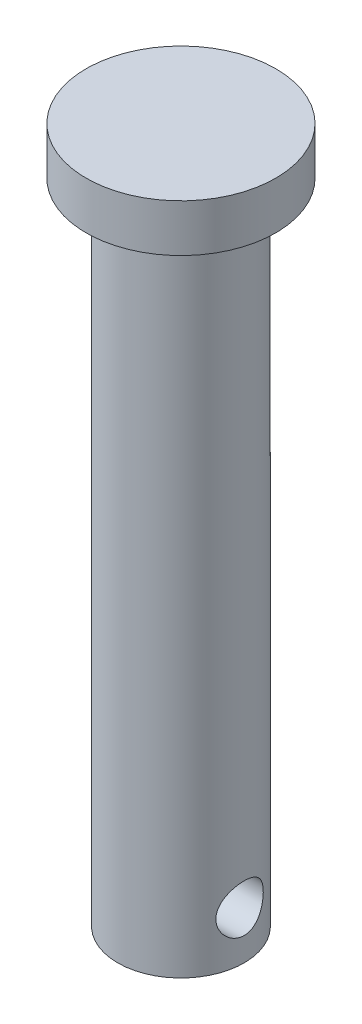
ISO-10303-21;
HEADER;
FILE_DESCRIPTION(('STEP AP214'),'2;1');
FILE_NAME('part.step','',(''),(''),'','','');
FILE_SCHEMA(('AUTOMOTIVE_DESIGN { 1 0 10303 214 1 1 1 1 }'));
ENDSEC;
DATA;
#1=APPLICATION_CONTEXT('core data for automotive mechanical design processes');
#2=APPLICATION_PROTOCOL_DEFINITION('international standard','automotive_design',2000,#1);
#3=PRODUCT_CONTEXT('',#1,'mechanical');
#4=PRODUCT('Part','Part','',(#3));
#5=PRODUCT_RELATED_PRODUCT_CATEGORY('part','',(#4));
#6=PRODUCT_DEFINITION_FORMATION('','',#4);
#7=PRODUCT_DEFINITION_CONTEXT('part definition',#1,'design');
#8=PRODUCT_DEFINITION('design','',#6,#7);
#9=PRODUCT_DEFINITION_SHAPE('','',#8);
#10=(LENGTH_UNIT() NAMED_UNIT(*) SI_UNIT(.MILLI.,.METRE.));
#11=(NAMED_UNIT(*) PLANE_ANGLE_UNIT() SI_UNIT($,.RADIAN.));
#12=(NAMED_UNIT(*) SI_UNIT($,.STERADIAN.) SOLID_ANGLE_UNIT());
#13=UNCERTAINTY_MEASURE_WITH_UNIT(LENGTH_MEASURE(1.E-05),#10,'distance_accuracy_value','');
#14=(GEOMETRIC_REPRESENTATION_CONTEXT(3) GLOBAL_UNCERTAINTY_ASSIGNED_CONTEXT((#13)) GLOBAL_UNIT_ASSIGNED_CONTEXT((#10,
#11,#12)) REPRESENTATION_CONTEXT('',''));
#15=CARTESIAN_POINT('',(0.,0.,0.));
#16=DIRECTION('',(0.,0.,1.));
#17=DIRECTION('',(1.,0.,0.));
#18=AXIS2_PLACEMENT_3D('',#15,#16,#17);
#19=CARTESIAN_POINT('',(0.,-34.,0.));
#20=DIRECTION('',(0.,1.,0.));
#21=DIRECTION('',(0.,0.,1.));
#22=AXIS2_PLACEMENT_3D('',#19,#20,#21);
#23=CYLINDRICAL_SURFACE('',#22,4.);
#24=CARTESIAN_POINT('',(3.7084298808649,-38.0495195041543,-1.49918238340381));
#25=CARTESIAN_POINT('',(3.70735153882818,-37.9689942578747,-1.50184556572112));
#26=CARTESIAN_POINT('',(3.70892688062295,-37.8882395568046,-1.49799349758537));
#27=CARTESIAN_POINT('',(3.71715993590129,-37.7286607449023,-1.47744506200237));
#28=CARTESIAN_POINT('',(3.72381701904395,-37.6498363958799,-1.46075028756678));
#29=CARTESIAN_POINT('',(3.74135277213261,-37.496489204384,-1.41522607325458));
#30=CARTESIAN_POINT('',(3.75222219397304,-37.4219573467462,-1.38642320479918));
#31=CARTESIAN_POINT('',(3.77692652400711,-37.2787811631056,-1.31763293053049));
#32=CARTESIAN_POINT('',(3.79076238816472,-37.2101387450383,-1.27764191796287));
#33=CARTESIAN_POINT('',(3.82057211864874,-37.0774299901233,-1.18560607122318));
#34=CARTESIAN_POINT('',(3.83661222672121,-37.0136861335884,-1.13311786291238));
#35=CARTESIAN_POINT('',(3.86864337007483,-36.8956288555774,-1.01840164354262));
#36=CARTESIAN_POINT('',(3.88463439210092,-36.8413177930982,-0.956171203478271));
#37=CARTESIAN_POINT('',(3.91557267695215,-36.7414038795145,-0.820560967202367));
#38=CARTESIAN_POINT('',(3.93044772922005,-36.6962634924048,-0.746822264879329));
#39=CARTESIAN_POINT('',(3.95669807204479,-36.6191380486328,-0.59218151317403));
#40=CARTESIAN_POINT('',(3.96807436243848,-36.5871492327805,-0.511281518791776));
#41=CARTESIAN_POINT('',(3.98567606756755,-36.5384557864282,-0.347708373466162));
#42=CARTESIAN_POINT('',(3.99207436038323,-36.5212358187946,-0.265207770069978));
#43=CARTESIAN_POINT('',(3.99966445088374,-36.5008640444887,-0.0982626967149754));
#44=CARTESIAN_POINT('',(4.00085818049662,-36.4977070176591,-0.0138189597482992));
#45=CARTESIAN_POINT('',(3.997987557776,-36.5053722818006,0.149782513511418));
#46=CARTESIAN_POINT('',(3.99420135768012,-36.5154550198635,0.228981160339728));
#47=CARTESIAN_POINT('',(3.98224464544293,-36.5479328436569,0.384459268726347));
#48=CARTESIAN_POINT('',(3.97407396706008,-36.5703283962398,0.460738619479362));
#49=CARTESIAN_POINT('',(3.9540973850599,-36.6268335818509,0.608887172196012));
#50=CARTESIAN_POINT('',(3.94226770310655,-36.6610200111714,0.680723726596261));
#51=CARTESIAN_POINT('',(3.91613389899252,-36.7400425640397,0.817783618955661));
#52=CARTESIAN_POINT('',(3.90182904647087,-36.7848818324351,0.883004995905559));
#53=CARTESIAN_POINT('',(3.87123344358808,-36.8869198447991,1.00895502567161));
#54=CARTESIAN_POINT('',(3.85487594418544,-36.9446779963665,1.06921470011159));
#55=CARTESIAN_POINT('',(3.82260207326242,-37.0694547610585,1.1794140590491));
#56=CARTESIAN_POINT('',(3.80668583965086,-37.1364762309377,1.22935054803286));
#57=CARTESIAN_POINT('',(3.77660289612442,-37.2804028548829,1.31893011255491));
#58=CARTESIAN_POINT('',(3.76250371584498,-37.3575457522116,1.35821591021273));
#59=CARTESIAN_POINT('',(3.73845685952126,-37.5179945744436,1.42307703579286));
#60=CARTESIAN_POINT('',(3.72850713897166,-37.6012974403541,1.44865911752738));
#61=CARTESIAN_POINT('',(3.71451183014456,-37.7673953239701,1.48416702082841));
#62=CARTESIAN_POINT('',(3.71020238710239,-37.8500176267676,1.49479441922828));
#63=CARTESIAN_POINT('',(3.70720681340884,-38.0159702327687,1.50221087766291));
#64=CARTESIAN_POINT('',(3.70851881920008,-38.0993002922039,1.4990045237));
#65=CARTESIAN_POINT('',(3.71635377515466,-38.2595189868606,1.47946292004948));
#66=CARTESIAN_POINT('',(3.72258995235245,-38.3365117178014,1.46384989805853));
#67=CARTESIAN_POINT('',(3.73915956251693,-38.4867171775777,1.42098877798612));
#68=CARTESIAN_POINT('',(3.74949373288406,-38.5599292234288,1.39373858582288));
#69=CARTESIAN_POINT('',(3.77344844932528,-38.7028706375696,1.32753713716937));
#70=CARTESIAN_POINT('',(3.78715457614463,-38.7724403933945,1.28827335672108));
#71=CARTESIAN_POINT('',(3.8162228839049,-38.9042673348096,1.19942662466771));
#72=CARTESIAN_POINT('',(3.83158565742597,-38.9665218870116,1.14983997464584));
#73=CARTESIAN_POINT('',(3.86346706469129,-39.086244666256,1.0378932311589));
#74=CARTESIAN_POINT('',(3.8799950657166,-39.1431258261599,0.974906095214866));
#75=CARTESIAN_POINT('',(3.91142238729319,-39.2456365998545,0.839980697952929));
#76=CARTESIAN_POINT('',(3.92632157538038,-39.2912652989112,0.768041709636549));
#77=CARTESIAN_POINT('',(3.95295267870394,-39.3701183388866,0.616529466815145));
#78=CARTESIAN_POINT('',(3.96466520535231,-39.4032671971622,0.536913303134666));
#79=CARTESIAN_POINT('',(3.983455968431,-39.455514044107,0.372685411784113));
#80=CARTESIAN_POINT('',(3.99053636039781,-39.4746185687365,0.288076027691915));
#81=CARTESIAN_POINT('',(3.99897877989662,-39.4973088836757,0.121400148734808));
#82=CARTESIAN_POINT('',(4.00064072242595,-39.5017089471445,0.0394592625631573));
#83=CARTESIAN_POINT('',(3.99891276324032,-39.4971001447576,-0.12398163379698));
#84=CARTESIAN_POINT('',(3.99552371713104,-39.4880935499057,-0.2054817163079));
#85=CARTESIAN_POINT('',(3.98424884471712,-39.4575423126647,-0.363056536261505));
#86=CARTESIAN_POINT('',(3.97650880322926,-39.4364037075558,-0.439221349172057));
#87=CARTESIAN_POINT('',(3.95741077544833,-39.3826528508869,-0.586897611437683));
#88=CARTESIAN_POINT('',(3.94605219945738,-39.350038729118,-0.658408300039859));
#89=CARTESIAN_POINT('',(3.92033471581983,-39.2729451785436,-0.797601126838279));
#90=CARTESIAN_POINT('',(3.90588230012393,-39.228079920934,-0.865051866338088));
#91=CARTESIAN_POINT('',(3.87566143207394,-39.1282780429793,-0.991713371692146));
#92=CARTESIAN_POINT('',(3.859892534614,-39.073338008753,-1.05092133244571));
#93=CARTESIAN_POINT('',(3.82770803196436,-38.9513130738008,-1.16285551509517));
#94=CARTESIAN_POINT('',(3.81130554383115,-38.8837209887232,-1.21503447385677));
#95=CARTESIAN_POINT('',(3.78062769464247,-38.7403018833863,-1.30737503130182));
#96=CARTESIAN_POINT('',(3.76635290207588,-38.6644726716108,-1.34753342114564));
#97=CARTESIAN_POINT('',(3.74090747981774,-38.5012811801681,-1.41671127308708));
#98=CARTESIAN_POINT('',(3.73000286452594,-38.4134883516224,-1.44482406815788));
#99=CARTESIAN_POINT('',(3.71438415779382,-38.2337350920049,-1.48452770919841));
#100=CARTESIAN_POINT('',(3.70966534558171,-38.1417778945373,-1.49613115505937));
#101=CARTESIAN_POINT('',(3.7084298808649,-38.0495195041543,-1.49918238340381));
#102=B_SPLINE_CURVE_WITH_KNOTS('',3,(#24,#25,#26,#27,#28,#29,#30,#31,#32,#33,#34,#35,#36,#37,
#38,#39,#40,#41,#42,#43,#44,#45,#46,#47,#48,#49,#50,#51,#52,#53,#54,#55,#56,#57,#58,#59,#60,#61,
#62,#63,#64,#65,#66,#67,#68,#69,#70,#71,#72,#73,#74,#75,#76,#77,#78,#79,#80,#81,#82,#83,#84,#85,
#86,#87,#88,#89,#90,#91,#92,#93,#94,#95,#96,#97,#98,#99,#100,#101),.UNSPECIFIED.,.T.,.F.,(4,2,2,
2,2,2,2,2,2,2,2,2,2,2,2,2,2,2,2,2,2,2,2,2,2,2,2,2,2,2,2,2,2,2,2,2,2,2,4),(0.,0.241390809926823,
0.48275168251987,0.723585627003748,0.964497299461813,1.21574031253197,1.46704606743034,
1.72892397556958,1.99072697749685,2.24297252270468,2.49512442667175,2.73377334593765,
2.97243131443655,3.2126740180258,3.45298773250122,3.70701924206622,3.96112926903046,
4.22293007689732,4.48460173847381,4.73353416952038,4.98238408376712,5.21772376025691,
5.45310580343223,5.69522355806603,5.93742820696935,6.1956181550003,6.45382908487313,
6.71357759311371,6.9732051427835,7.21819383138389,7.46314102515906,7.70033216519318,
7.93756197909594,8.18335564634208,8.42923275624425,8.68885290085673,8.94854228827955,
9.22531693214422,9.50188022882432),.UNSPECIFIED.);
#103=CARTESIAN_POINT('',(3.7084298808649,-38.0495195041543,-1.49918238340381));
#104=VERTEX_POINT('',#103);
#105=EDGE_CURVE('E36',#104,#104,#102,.T.);
#106=ORIENTED_EDGE('',*,*,#105,.F.);
#107=EDGE_LOOP('',(#106));
#108=FACE_BOUND('',#107,.T.);
#109=CARTESIAN_POINT('',(-3.7084298808649,-37.9504804958457,-1.49918238340381));
#110=CARTESIAN_POINT('',(-3.70735153882818,-38.0310057421253,-1.50184556572112));
#111=CARTESIAN_POINT('',(-3.70892688062294,-38.1117604431954,-1.49799349758538));
#112=CARTESIAN_POINT('',(-3.7171599359013,-38.2713392550977,-1.47744506200237));
#113=CARTESIAN_POINT('',(-3.72381701904396,-38.3501636041201,-1.46075028756677));
#114=CARTESIAN_POINT('',(-3.74135277213262,-38.503510795616,-1.41522607325457));
#115=CARTESIAN_POINT('',(-3.75222219397304,-38.5780426532538,-1.38642320479918));
#116=CARTESIAN_POINT('',(-3.77692652400711,-38.7212188368944,-1.31763293053049));
#117=CARTESIAN_POINT('',(-3.79076238816473,-38.7898612549617,-1.27764191796286));
#118=CARTESIAN_POINT('',(-3.82057211864875,-38.9225700098767,-1.18560607122317));
#119=CARTESIAN_POINT('',(-3.83661222672122,-38.9863138664116,-1.13311786291238));
#120=CARTESIAN_POINT('',(-3.86864337007483,-39.1043711444226,-1.01840164354262));
#121=CARTESIAN_POINT('',(-3.88463439210093,-39.1586822069018,-0.956171203478263));
#122=CARTESIAN_POINT('',(-3.91557267695215,-39.2585961204855,-0.820560967202357));
#123=CARTESIAN_POINT('',(-3.93044772922005,-39.3037365075952,-0.74682226487932));
#124=CARTESIAN_POINT('',(-3.95669807204479,-39.3808619513672,-0.592181513174017));
#125=CARTESIAN_POINT('',(-3.96807436243848,-39.4128507672195,-0.51128151879176));
#126=CARTESIAN_POINT('',(-3.98567606756755,-39.4615442135718,-0.347708373466142));
#127=CARTESIAN_POINT('',(-3.99207436038323,-39.4787641812054,-0.26520777006996));
#128=CARTESIAN_POINT('',(-3.99966445088374,-39.4991359555113,-0.0982626967149576));
#129=CARTESIAN_POINT('',(-4.00085818049662,-39.5022929823409,-0.0138189597482813));
#130=CARTESIAN_POINT('',(-3.997987557776,-39.4946277181994,0.149782513511435));
#131=CARTESIAN_POINT('',(-3.99420135768012,-39.4845449801365,0.228981160339746));
#132=CARTESIAN_POINT('',(-3.98224464544293,-39.4520671563431,0.384459268726364));
#133=CARTESIAN_POINT('',(-3.97407396706008,-39.4296716037602,0.460738619479378));
#134=CARTESIAN_POINT('',(-3.9540973850599,-39.3731664181491,0.608887172196025));
#135=CARTESIAN_POINT('',(-3.94226770310655,-39.3389799888286,0.680723726596271));
#136=CARTESIAN_POINT('',(-3.91613389899251,-39.2599574359603,0.817783618955672));
#137=CARTESIAN_POINT('',(-3.90182904647086,-39.2151181675649,0.883004995905573));
#138=CARTESIAN_POINT('',(-3.87123344358808,-39.1130801552009,1.00895502567162));
#139=CARTESIAN_POINT('',(-3.85487594418544,-39.0553220036335,1.06921470011159));
#140=CARTESIAN_POINT('',(-3.82260207326242,-38.9305452389415,1.1794140590491));
#141=CARTESIAN_POINT('',(-3.80668583965086,-38.8635237690623,1.22935054803287));
#142=CARTESIAN_POINT('',(-3.77660289612442,-38.7195971451171,1.31893011255492));
#143=CARTESIAN_POINT('',(-3.76250371584498,-38.6424542477884,1.35821591021273));
#144=CARTESIAN_POINT('',(-3.73845685952126,-38.4820054255564,1.42307703579286));
#145=CARTESIAN_POINT('',(-3.72850713897166,-38.3987025596459,1.44865911752738));
#146=CARTESIAN_POINT('',(-3.71451183014456,-38.2326046760299,1.48416702082842));
#147=CARTESIAN_POINT('',(-3.71020238710239,-38.1499823732324,1.49479441922828));
#148=CARTESIAN_POINT('',(-3.70720681340884,-37.9840297672313,1.5022108776629));
#149=CARTESIAN_POINT('',(-3.70851881920008,-37.9006997077961,1.49900452369999));
#150=CARTESIAN_POINT('',(-3.71635377515466,-37.7404810131394,1.47946292004948));
#151=CARTESIAN_POINT('',(-3.72258995235245,-37.6634882821986,1.46384989805853));
#152=CARTESIAN_POINT('',(-3.73915956251693,-37.5132828224223,1.42098877798612));
#153=CARTESIAN_POINT('',(-3.74949373288407,-37.4400707765713,1.39373858582287));
#154=CARTESIAN_POINT('',(-3.77344844932528,-37.2971293624304,1.32753713716936));
#155=CARTESIAN_POINT('',(-3.78715457614463,-37.2275596066055,1.28827335672108));
#156=CARTESIAN_POINT('',(-3.81622288390489,-37.0957326651904,1.19942662466772));
#157=CARTESIAN_POINT('',(-3.83158565742597,-37.0334781129884,1.14983997464584));
#158=CARTESIAN_POINT('',(-3.8634670646913,-36.913755333744,1.03789323115889));
#159=CARTESIAN_POINT('',(-3.8799950657166,-36.8568741738401,0.974906095214866));
#160=CARTESIAN_POINT('',(-3.91142238729319,-36.7543634001455,0.839980697952928));
#161=CARTESIAN_POINT('',(-3.92632157538038,-36.7087347010888,0.76804170963654));
#162=CARTESIAN_POINT('',(-3.95295267870394,-36.6298816611134,0.616529466815131));
#163=CARTESIAN_POINT('',(-3.96466520535231,-36.5967328028378,0.536913303134656));
#164=CARTESIAN_POINT('',(-3.98345596843101,-36.544485955893,0.372685411784102));
#165=CARTESIAN_POINT('',(-3.99053636039782,-36.5253814312635,0.2880760276919));
#166=CARTESIAN_POINT('',(-3.99897877989662,-36.5026911163243,0.121400148734788));
#167=CARTESIAN_POINT('',(-4.00064072242595,-36.4982910528555,0.0394592625631396));
#168=CARTESIAN_POINT('',(-3.99891276324032,-36.5028998552424,-0.123981633796996));
#169=CARTESIAN_POINT('',(-3.99552371713104,-36.5119064500943,-0.205481716307916));
#170=CARTESIAN_POINT('',(-3.98424884471712,-36.5424576873353,-0.363056536261521));
#171=CARTESIAN_POINT('',(-3.97650880322925,-36.5635962924442,-0.439221349172073));
#172=CARTESIAN_POINT('',(-3.95741077544833,-36.6173471491131,-0.586897611437698));
#173=CARTESIAN_POINT('',(-3.94605219945738,-36.649961270882,-0.658408300039873));
#174=CARTESIAN_POINT('',(-3.92033471581982,-36.7270548214565,-0.797601126838299));
#175=CARTESIAN_POINT('',(-3.90588230012393,-36.771920079066,-0.865051866338114));
#176=CARTESIAN_POINT('',(-3.87566143207393,-36.8717219570207,-0.991713371692169));
#177=CARTESIAN_POINT('',(-3.85989253461399,-36.926661991247,-1.05092133244572));
#178=CARTESIAN_POINT('',(-3.82770803196435,-37.0486869261992,-1.16285551509517));
#179=CARTESIAN_POINT('',(-3.81130554383115,-37.1162790112769,-1.21503447385678));
#180=CARTESIAN_POINT('',(-3.78062769464246,-37.2596981166137,-1.30737503130183));
#181=CARTESIAN_POINT('',(-3.76635290207588,-37.3355273283892,-1.34753342114565));
#182=CARTESIAN_POINT('',(-3.74090747981774,-37.4987188198319,-1.41671127308709));
#183=CARTESIAN_POINT('',(-3.73000286452594,-37.5865116483776,-1.44482406815788));
#184=CARTESIAN_POINT('',(-3.71438415779382,-37.7662649079951,-1.48452770919841));
#185=CARTESIAN_POINT('',(-3.70966534558171,-37.8582221054627,-1.49613115505937));
#186=CARTESIAN_POINT('',(-3.7084298808649,-37.9504804958457,-1.49918238340381));
#187=B_SPLINE_CURVE_WITH_KNOTS('',3,(#109,#110,#111,#112,#113,#114,#115,#116,#117,#118,#119,
#120,#121,#122,#123,#124,#125,#126,#127,#128,#129,#130,#131,#132,#133,#134,#135,#136,#137,#138,
#139,#140,#141,#142,#143,#144,#145,#146,#147,#148,#149,#150,#151,#152,#153,#154,#155,#156,#157,
#158,#159,#160,#161,#162,#163,#164,#165,#166,#167,#168,#169,#170,#171,#172,#173,#174,#175,#176,
#177,#178,#179,#180,#181,#182,#183,#184,#185,#186),.UNSPECIFIED.,.T.,.F.,(4,2,2,2,2,2,2,2,2,2,2,
2,2,2,2,2,2,2,2,2,2,2,2,2,2,2,2,2,2,2,2,2,2,2,2,2,2,2,4),(0.,0.24139080992683,0.482751682519872,
0.723585627003739,0.964497299461811,1.21574031253198,1.46704606743035,1.72892397556959,
1.99072697749687,2.24297252270469,2.49512442667176,2.73377334593766,2.97243131443656,
3.21267401802581,3.45298773250123,3.70701924206622,3.96112926903046,4.22293007689731,
4.4846017384738,4.73353416952038,4.98238408376712,5.2177237602569,5.45310580343223,
5.69522355806602,5.93742820696935,6.1956181550003,6.45382908487313,6.71357759311371,
6.97320514278351,7.2181938313839,7.46314102515906,7.70033216519319,7.93756197909594,
8.1833556463421,8.42923275624428,8.68885290085674,8.94854228827954,9.22531693214421,
9.5018802288243),.UNSPECIFIED.);
#188=CARTESIAN_POINT('',(-3.7084298808649,-37.9504804958457,-1.49918238340381));
#189=VERTEX_POINT('',#188);
#190=EDGE_CURVE('E29',#189,#189,#187,.T.);
#191=ORIENTED_EDGE('',*,*,#190,.F.);
#192=EDGE_LOOP('',(#191));
#193=FACE_BOUND('',#192,.T.);
#194=CARTESIAN_POINT('',(0.,-41.,0.));
#195=DIRECTION('',(0.,1.,0.));
#196=DIRECTION('',(0.,0.,1.));
#197=AXIS2_PLACEMENT_3D('',#194,#195,#196);
#198=CIRCLE('',#197,4.);
#199=CARTESIAN_POINT('',(0.,-41.,4.));
#200=VERTEX_POINT('',#199);
#201=EDGE_CURVE('E10',#200,#200,#198,.T.);
#202=ORIENTED_EDGE('',*,*,#201,.T.);
#203=EDGE_LOOP('',(#202));
#204=FACE_BOUND('',#203,.T.);
#205=CARTESIAN_POINT('',(0.,0.,0.));
#206=DIRECTION('',(0.,-1.,0.));
#207=DIRECTION('',(0.,0.,-1.));
#208=AXIS2_PLACEMENT_3D('',#205,#206,#207);
#209=CIRCLE('',#208,4.);
#210=CARTESIAN_POINT('',(0.,0.,-4.));
#211=VERTEX_POINT('',#210);
#212=EDGE_CURVE('E19',#211,#211,#209,.F.);
#213=ORIENTED_EDGE('',*,*,#212,.F.);
#214=EDGE_LOOP('',(#213));
#215=FACE_BOUND('',#214,.T.);
#216=ADVANCED_FACE('F15',(#108,#193,#204,#215),#23,.T.);
#217=CARTESIAN_POINT('',(0.,-41.,0.));
#218=DIRECTION('',(0.,1.,0.));
#219=DIRECTION('',(0.,0.,1.));
#220=AXIS2_PLACEMENT_3D('',#217,#218,#219);
#221=PLANE('',#220);
#222=ORIENTED_EDGE('',*,*,#201,.F.);
#223=EDGE_LOOP('',(#222));
#224=FACE_BOUND('',#223,.T.);
#225=ADVANCED_FACE('F49',(#224),#221,.F.);
#226=CARTESIAN_POINT('',(0.,3.,0.));
#227=DIRECTION('',(0.,-1.,0.));
#228=DIRECTION('',(0.,0.,-1.));
#229=AXIS2_PLACEMENT_3D('',#226,#227,#228);
#230=CYLINDRICAL_SURFACE('',#229,6.);
#231=CARTESIAN_POINT('',(0.,3.,0.));
#232=DIRECTION('',(0.,-1.,0.));
#233=DIRECTION('',(0.,0.,-1.));
#234=AXIS2_PLACEMENT_3D('',#231,#232,#233);
#235=CIRCLE('',#234,6.);
#236=CARTESIAN_POINT('',(0.,3.,-6.));
#237=VERTEX_POINT('',#236);
#238=EDGE_CURVE('E27',#237,#237,#235,.T.);
#239=ORIENTED_EDGE('',*,*,#238,.T.);
#240=EDGE_LOOP('',(#239));
#241=FACE_BOUND('',#240,.T.);
#242=CARTESIAN_POINT('',(0.,0.,0.));
#243=DIRECTION('',(0.,-1.,0.));
#244=DIRECTION('',(0.,0.,-1.));
#245=AXIS2_PLACEMENT_3D('',#242,#243,#244);
#246=CIRCLE('',#245,6.);
#247=CARTESIAN_POINT('',(0.,0.,-6.));
#248=VERTEX_POINT('',#247);
#249=EDGE_CURVE('E79',#248,#248,#246,.T.);
#250=ORIENTED_EDGE('',*,*,#249,.F.);
#251=EDGE_LOOP('',(#250));
#252=FACE_BOUND('',#251,.T.);
#253=ADVANCED_FACE('F52',(#241,#252),#230,.T.);
#254=CARTESIAN_POINT('',(0.,3.,0.));
#255=DIRECTION('',(0.,-1.,0.));
#256=DIRECTION('',(0.,0.,-1.));
#257=AXIS2_PLACEMENT_3D('',#254,#255,#256);
#258=PLANE('',#257);
#259=ORIENTED_EDGE('',*,*,#238,.F.);
#260=EDGE_LOOP('',(#259));
#261=FACE_BOUND('',#260,.T.);
#262=ADVANCED_FACE('F55',(#261),#258,.F.);
#263=CARTESIAN_POINT('',(0.,0.,0.));
#264=DIRECTION('',(0.,-1.,0.));
#265=DIRECTION('',(0.,0.,-1.));
#266=AXIS2_PLACEMENT_3D('',#263,#264,#265);
#267=PLANE('',#266);
#268=ORIENTED_EDGE('',*,*,#212,.T.);
#269=EDGE_LOOP('',(#268));
#270=FACE_BOUND('',#269,.T.);
#271=ORIENTED_EDGE('',*,*,#249,.T.);
#272=EDGE_LOOP('',(#271));
#273=FACE_BOUND('',#272,.T.);
#274=ADVANCED_FACE('F46',(#270,#273),#267,.T.);
#275=CARTESIAN_POINT('',(13.2297211412081,-38.,0.));
#276=DIRECTION('',(-1.,0.,0.));
#277=DIRECTION('',(0.,0.,1.));
#278=AXIS2_PLACEMENT_3D('',#275,#276,#277);
#279=CYLINDRICAL_SURFACE('',#278,1.5);
#280=ORIENTED_EDGE('',*,*,#105,.T.);
#281=EDGE_LOOP('',(#280));
#282=FACE_BOUND('',#281,.T.);
#283=ORIENTED_EDGE('',*,*,#190,.T.);
#284=EDGE_LOOP('',(#283));
#285=FACE_BOUND('',#284,.T.);
#286=ADVANCED_FACE('F41',(#282,#285),#279,.F.);
#287=CLOSED_SHELL('',(#216,#225,#253,#262,#274,#286));
#288=MANIFOLD_SOLID_BREP('B1',#287);
#289=ADVANCED_BREP_SHAPE_REPRESENTATION('',(#18,#288),#14);
#290=SHAPE_DEFINITION_REPRESENTATION(#9,#289);
ENDSEC;
END-ISO-10303-21;
